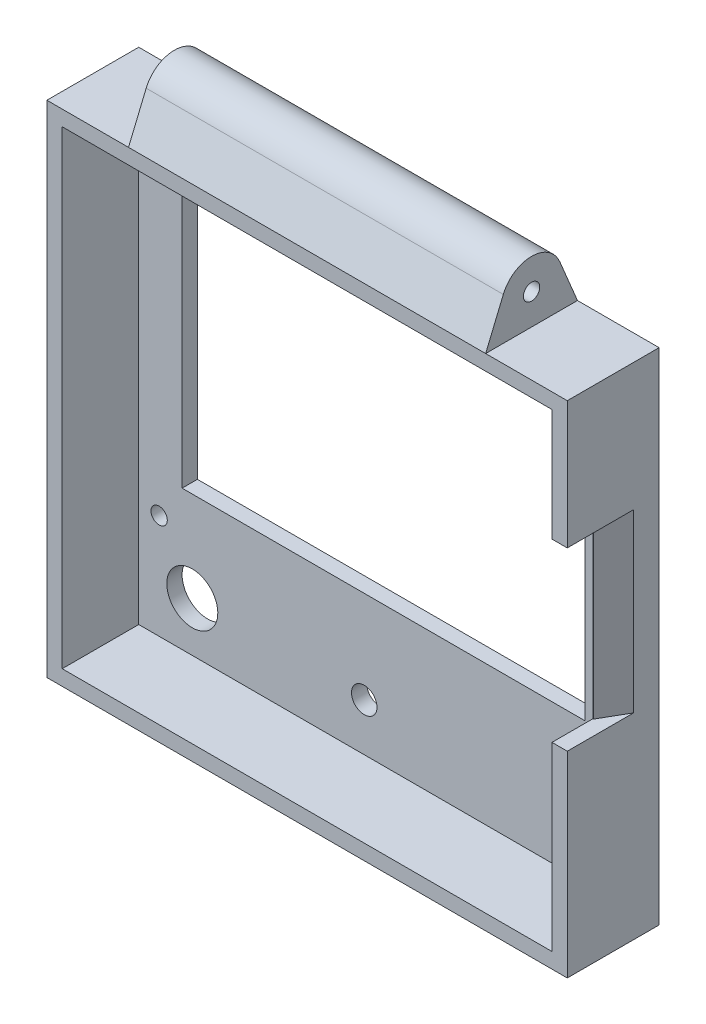
ISO-10303-21;
HEADER;
FILE_DESCRIPTION(('STEP AP214'),'2;1');
FILE_NAME('part.step','',(''),(''),'','','');
FILE_SCHEMA(('AUTOMOTIVE_DESIGN { 1 0 10303 214 1 1 1 1 }'));
ENDSEC;
DATA;
#1=APPLICATION_CONTEXT('core data for automotive mechanical design processes');
#2=APPLICATION_PROTOCOL_DEFINITION('international standard','automotive_design',2000,#1);
#3=PRODUCT_CONTEXT('',#1,'mechanical');
#4=PRODUCT('Part','Part','',(#3));
#5=PRODUCT_RELATED_PRODUCT_CATEGORY('part','',(#4));
#6=PRODUCT_DEFINITION_FORMATION('','',#4);
#7=PRODUCT_DEFINITION_CONTEXT('part definition',#1,'design');
#8=PRODUCT_DEFINITION('design','',#6,#7);
#9=PRODUCT_DEFINITION_SHAPE('','',#8);
#10=(LENGTH_UNIT() NAMED_UNIT(*) SI_UNIT(.MILLI.,.METRE.));
#11=(NAMED_UNIT(*) PLANE_ANGLE_UNIT() SI_UNIT($,.RADIAN.));
#12=(NAMED_UNIT(*) SI_UNIT($,.STERADIAN.) SOLID_ANGLE_UNIT());
#13=UNCERTAINTY_MEASURE_WITH_UNIT(LENGTH_MEASURE(1.E-05),#10,'distance_accuracy_value','');
#14=(GEOMETRIC_REPRESENTATION_CONTEXT(3) GLOBAL_UNCERTAINTY_ASSIGNED_CONTEXT((#13)) GLOBAL_UNIT_ASSIGNED_CONTEXT((#10,
#11,#12)) REPRESENTATION_CONTEXT('',''));
#15=CARTESIAN_POINT('',(0.,0.,0.));
#16=DIRECTION('',(0.,0.,1.));
#17=DIRECTION('',(1.,0.,0.));
#18=AXIS2_PLACEMENT_3D('',#15,#16,#17);
#19=CARTESIAN_POINT('',(51.,98.,0.));
#20=DIRECTION('',(0.,0.,-1.));
#21=DIRECTION('',(0.,1.,0.));
#22=AXIS2_PLACEMENT_3D('',#19,#20,#21);
#23=PLANE('',#22);
#24=DIRECTION('',(0.,-1.,0.));
#25=VECTOR('',#24,1.);
#26=CARTESIAN_POINT('',(48.,98.,0.));
#27=LINE('',#26,#25);
#28=CARTESIAN_POINT('',(48.,95.,0.));
#29=VERTEX_POINT('',#28);
#30=CARTESIAN_POINT('',(48.,73.,0.));
#31=VERTEX_POINT('',#30);
#32=EDGE_CURVE('E377',#29,#31,#27,.T.);
#33=ORIENTED_EDGE('',*,*,#32,.T.);
#34=DIRECTION('',(1.,0.,0.));
#35=VECTOR('',#34,1.);
#36=CARTESIAN_POINT('',(41.,73.,0.));
#37=LINE('',#36,#35);
#38=CARTESIAN_POINT('',(51.,73.,0.));
#39=VERTEX_POINT('',#38);
#40=EDGE_CURVE('E258',#31,#39,#37,.T.);
#41=ORIENTED_EDGE('',*,*,#40,.T.);
#42=DIRECTION('',(0.,-1.,0.));
#43=VECTOR('',#42,1.);
#44=CARTESIAN_POINT('',(51.,98.,0.));
#45=LINE('',#44,#43);
#46=CARTESIAN_POINT('',(51.,98.,0.));
#47=VERTEX_POINT('',#46);
#48=EDGE_CURVE('E194',#47,#39,#45,.T.);
#49=ORIENTED_EDGE('',*,*,#48,.F.);
#50=DIRECTION('',(-1.,0.,0.));
#51=VECTOR('',#50,1.);
#52=CARTESIAN_POINT('',(51.,98.,0.));
#53=LINE('',#52,#51);
#54=CARTESIAN_POINT('',(35.,98.,0.));
#55=VERTEX_POINT('',#54);
#56=EDGE_CURVE('E214',#47,#55,#53,.T.);
#57=ORIENTED_EDGE('',*,*,#56,.T.);
#58=CARTESIAN_POINT('',(-35.,98.,0.));
#59=VERTEX_POINT('',#58);
#60=EDGE_CURVE('E209',#55,#59,#53,.T.);
#61=ORIENTED_EDGE('',*,*,#60,.T.);
#62=DIRECTION('',(-1.,0.,0.));
#63=VECTOR('',#62,1.);
#64=CARTESIAN_POINT('',(-35.,98.,0.));
#65=LINE('',#64,#63);
#66=CARTESIAN_POINT('',(-51.,98.,0.));
#67=VERTEX_POINT('',#66);
#68=EDGE_CURVE('E262',#59,#67,#65,.T.);
#69=ORIENTED_EDGE('',*,*,#68,.T.);
#70=DIRECTION('',(0.,-1.,0.));
#71=VECTOR('',#70,1.);
#72=CARTESIAN_POINT('',(-51.,98.,0.));
#73=LINE('',#72,#71);
#74=CARTESIAN_POINT('',(-51.,0.,0.));
#75=VERTEX_POINT('',#74);
#76=EDGE_CURVE('E210',#67,#75,#73,.T.);
#77=ORIENTED_EDGE('',*,*,#76,.T.);
#78=DIRECTION('',(-1.,0.,0.));
#79=VECTOR('',#78,1.);
#80=CARTESIAN_POINT('',(51.,0.,0.));
#81=LINE('',#80,#79);
#82=CARTESIAN_POINT('',(51.,0.,0.));
#83=VERTEX_POINT('',#82);
#84=EDGE_CURVE('E193',#83,#75,#81,.T.);
#85=ORIENTED_EDGE('',*,*,#84,.F.);
#86=CARTESIAN_POINT('',(51.,38.5,0.));
#87=VERTEX_POINT('',#86);
#88=EDGE_CURVE('E183',#87,#83,#45,.T.);
#89=ORIENTED_EDGE('',*,*,#88,.F.);
#90=DIRECTION('',(1.,0.,0.));
#91=VECTOR('',#90,1.);
#92=CARTESIAN_POINT('',(41.,38.5,0.));
#93=LINE('',#92,#91);
#94=CARTESIAN_POINT('',(48.,38.5,0.));
#95=VERTEX_POINT('',#94);
#96=EDGE_CURVE('E173',#95,#87,#93,.T.);
#97=ORIENTED_EDGE('',*,*,#96,.F.);
#98=CARTESIAN_POINT('',(48.,3.,0.));
#99=VERTEX_POINT('',#98);
#100=EDGE_CURVE('E386',#95,#99,#27,.T.);
#101=ORIENTED_EDGE('',*,*,#100,.T.);
#102=DIRECTION('',(-1.,0.,0.));
#103=VECTOR('',#102,1.);
#104=CARTESIAN_POINT('',(51.,3.,0.));
#105=LINE('',#104,#103);
#106=CARTESIAN_POINT('',(-48.,3.,0.));
#107=VERTEX_POINT('',#106);
#108=EDGE_CURVE('E212',#99,#107,#105,.T.);
#109=ORIENTED_EDGE('',*,*,#108,.T.);
#110=DIRECTION('',(0.,-1.,0.));
#111=VECTOR('',#110,1.);
#112=CARTESIAN_POINT('',(-48.,98.,0.));
#113=LINE('',#112,#111);
#114=CARTESIAN_POINT('',(-48.,95.,0.));
#115=VERTEX_POINT('',#114);
#116=EDGE_CURVE('E203',#115,#107,#113,.T.);
#117=ORIENTED_EDGE('',*,*,#116,.F.);
#118=DIRECTION('',(-1.,0.,0.));
#119=VECTOR('',#118,1.);
#120=CARTESIAN_POINT('',(51.,95.,0.));
#121=LINE('',#120,#119);
#122=EDGE_CURVE('E382',#29,#115,#121,.T.);
#123=ORIENTED_EDGE('',*,*,#122,.F.);
#124=EDGE_LOOP('',(#33,#41,#49,#57,#61,#69,#77,#85,#89,#97,#101,#109,#117,#123));
#125=FACE_BOUND('',#124,.T.);
#126=ADVANCED_FACE('F33',(#125),#23,.F.);
#127=CARTESIAN_POINT('',(51.,0.,0.));
#128=DIRECTION('',(0.,1.,0.));
#129=DIRECTION('',(0.,0.,1.));
#130=AXIS2_PLACEMENT_3D('',#127,#128,#129);
#131=PLANE('',#130);
#132=DIRECTION('',(0.,0.,-1.));
#133=VECTOR('',#132,1.);
#134=CARTESIAN_POINT('',(-51.,0.,0.));
#135=LINE('',#134,#133);
#136=CARTESIAN_POINT('',(-51.,0.,-18.));
#137=VERTEX_POINT('',#136);
#138=EDGE_CURVE('E199',#75,#137,#135,.T.);
#139=ORIENTED_EDGE('',*,*,#138,.T.);
#140=DIRECTION('',(-1.,0.,0.));
#141=VECTOR('',#140,1.);
#142=CARTESIAN_POINT('',(51.,0.,-18.));
#143=LINE('',#142,#141);
#144=CARTESIAN_POINT('',(51.,0.,-18.));
#145=VERTEX_POINT('',#144);
#146=EDGE_CURVE('E221',#145,#137,#143,.T.);
#147=ORIENTED_EDGE('',*,*,#146,.F.);
#148=DIRECTION('',(0.,0.,-1.));
#149=VECTOR('',#148,1.);
#150=CARTESIAN_POINT('',(51.,0.,0.));
#151=LINE('',#150,#149);
#152=EDGE_CURVE('E197',#83,#145,#151,.T.);
#153=ORIENTED_EDGE('',*,*,#152,.F.);
#154=ORIENTED_EDGE('',*,*,#84,.T.);
#155=EDGE_LOOP('',(#139,#147,#153,#154));
#156=FACE_BOUND('',#155,.T.);
#157=ADVANCED_FACE('F443',(#156),#131,.F.);
#158=CARTESIAN_POINT('',(51.,0.,-18.));
#159=DIRECTION('',(0.,0.,1.));
#160=DIRECTION('',(0.,-1.,0.));
#161=AXIS2_PLACEMENT_3D('',#158,#159,#160);
#162=PLANE('',#161);
#163=CARTESIAN_POINT('',(-3.79999999999999,12.3,-18.));
#164=DIRECTION('',(0.,0.,-1.));
#165=DIRECTION('',(-1.,0.,0.));
#166=AXIS2_PLACEMENT_3D('',#163,#164,#165);
#167=CIRCLE('',#166,2.5);
#168=CARTESIAN_POINT('',(-6.29999999999999,12.3,-18.));
#169=VERTEX_POINT('',#168);
#170=EDGE_CURVE('E292',#169,#169,#167,.T.);
#171=ORIENTED_EDGE('',*,*,#170,.F.);
#172=EDGE_LOOP('',(#171));
#173=FACE_BOUND('',#172,.T.);
#174=CARTESIAN_POINT('',(36.75,15.3,-18.));
#175=DIRECTION('',(0.,0.,-1.));
#176=DIRECTION('',(-1.,0.,0.));
#177=AXIS2_PLACEMENT_3D('',#174,#175,#176);
#178=CIRCLE('',#177,3.);
#179=CARTESIAN_POINT('',(33.75,15.3,-18.));
#180=VERTEX_POINT('',#179);
#181=EDGE_CURVE('E308',#180,#180,#178,.T.);
#182=ORIENTED_EDGE('',*,*,#181,.F.);
#183=EDGE_LOOP('',(#182));
#184=FACE_BOUND('',#183,.T.);
#185=CARTESIAN_POINT('',(-37.5,12.7,-18.));
#186=DIRECTION('',(0.,0.,-1.));
#187=DIRECTION('',(-1.,0.,0.));
#188=AXIS2_PLACEMENT_3D('',#185,#186,#187);
#189=CIRCLE('',#188,5.);
#190=CARTESIAN_POINT('',(-42.5,12.7,-18.));
#191=VERTEX_POINT('',#190);
#192=EDGE_CURVE('E302',#191,#191,#189,.T.);
#193=ORIENTED_EDGE('',*,*,#192,.F.);
#194=EDGE_LOOP('',(#193));
#195=FACE_BOUND('',#194,.T.);
#196=CARTESIAN_POINT('',(-44.,23.5,-18.));
#197=DIRECTION('',(0.,0.,-1.));
#198=DIRECTION('',(-1.,0.,0.));
#199=AXIS2_PLACEMENT_3D('',#196,#197,#198);
#200=CIRCLE('',#199,1.6);
#201=CARTESIAN_POINT('',(-45.6,23.5,-18.));
#202=VERTEX_POINT('',#201);
#203=EDGE_CURVE('E294',#202,#202,#200,.T.);
#204=ORIENTED_EDGE('',*,*,#203,.F.);
#205=EDGE_LOOP('',(#204));
#206=FACE_BOUND('',#205,.T.);
#207=CARTESIAN_POINT('',(44.,23.5,-18.));
#208=DIRECTION('',(0.,0.,-1.));
#209=DIRECTION('',(-1.,0.,0.));
#210=AXIS2_PLACEMENT_3D('',#207,#208,#209);
#211=CIRCLE('',#210,1.6);
#212=CARTESIAN_POINT('',(42.4,23.5,-18.));
#213=VERTEX_POINT('',#212);
#214=EDGE_CURVE('E301',#213,#213,#211,.T.);
#215=ORIENTED_EDGE('',*,*,#214,.F.);
#216=EDGE_LOOP('',(#215));
#217=FACE_BOUND('',#216,.T.);
#218=CARTESIAN_POINT('',(44.,88.5,-18.));
#219=DIRECTION('',(0.,0.,-1.));
#220=DIRECTION('',(-1.,0.,0.));
#221=AXIS2_PLACEMENT_3D('',#218,#219,#220);
#222=CIRCLE('',#221,1.6);
#223=CARTESIAN_POINT('',(42.4,88.5,-18.));
#224=VERTEX_POINT('',#223);
#225=EDGE_CURVE('E326',#224,#224,#222,.T.);
#226=ORIENTED_EDGE('',*,*,#225,.F.);
#227=EDGE_LOOP('',(#226));
#228=FACE_BOUND('',#227,.T.);
#229=CARTESIAN_POINT('',(-44.,88.5,-18.));
#230=DIRECTION('',(0.,0.,-1.));
#231=DIRECTION('',(-1.,0.,0.));
#232=AXIS2_PLACEMENT_3D('',#229,#230,#231);
#233=CIRCLE('',#232,1.6);
#234=CARTESIAN_POINT('',(-45.6,88.5,-18.));
#235=VERTEX_POINT('',#234);
#236=EDGE_CURVE('E318',#235,#235,#233,.T.);
#237=ORIENTED_EDGE('',*,*,#236,.F.);
#238=EDGE_LOOP('',(#237));
#239=FACE_BOUND('',#238,.T.);
#240=DIRECTION('',(0.,-1.,0.));
#241=VECTOR('',#240,1.);
#242=CARTESIAN_POINT('',(39.5,82.,-18.));
#243=LINE('',#242,#241);
#244=CARTESIAN_POINT('',(39.5,82.,-18.));
#245=VERTEX_POINT('',#244);
#246=CARTESIAN_POINT('',(39.5,30.4,-18.));
#247=VERTEX_POINT('',#246);
#248=EDGE_CURVE('E339',#245,#247,#243,.T.);
#249=ORIENTED_EDGE('',*,*,#248,.F.);
#250=DIRECTION('',(1.,0.,0.));
#251=VECTOR('',#250,1.);
#252=CARTESIAN_POINT('',(39.5,82.,-18.));
#253=LINE('',#252,#251);
#254=CARTESIAN_POINT('',(-39.5,82.,-18.));
#255=VERTEX_POINT('',#254);
#256=EDGE_CURVE('E342',#255,#245,#253,.T.);
#257=ORIENTED_EDGE('',*,*,#256,.F.);
#258=DIRECTION('',(0.,1.,0.));
#259=VECTOR('',#258,1.);
#260=CARTESIAN_POINT('',(-39.5,82.,-18.));
#261=LINE('',#260,#259);
#262=CARTESIAN_POINT('',(-39.5,30.4,-18.));
#263=VERTEX_POINT('',#262);
#264=EDGE_CURVE('E325',#263,#255,#261,.T.);
#265=ORIENTED_EDGE('',*,*,#264,.F.);
#266=DIRECTION('',(-1.,0.,0.));
#267=VECTOR('',#266,1.);
#268=CARTESIAN_POINT('',(39.5,30.4,-18.));
#269=LINE('',#268,#267);
#270=EDGE_CURVE('E336',#247,#263,#269,.T.);
#271=ORIENTED_EDGE('',*,*,#270,.F.);
#272=EDGE_LOOP('',(#249,#257,#265,#271));
#273=FACE_BOUND('',#272,.T.);
#274=DIRECTION('',(0.,1.,0.));
#275=VECTOR('',#274,1.);
#276=CARTESIAN_POINT('',(-51.,0.,-18.));
#277=LINE('',#276,#275);
#278=CARTESIAN_POINT('',(-51.,98.,-18.));
#279=VERTEX_POINT('',#278);
#280=EDGE_CURVE('E195',#137,#279,#277,.T.);
#281=ORIENTED_EDGE('',*,*,#280,.T.);
#282=DIRECTION('',(-1.,0.,0.));
#283=VECTOR('',#282,1.);
#284=CARTESIAN_POINT('',(-35.,98.,-18.));
#285=LINE('',#284,#283);
#286=CARTESIAN_POINT('',(-35.,98.,-18.));
#287=VERTEX_POINT('',#286);
#288=EDGE_CURVE('E266',#287,#279,#285,.T.);
#289=ORIENTED_EDGE('',*,*,#288,.F.);
#290=DIRECTION('',(-1.,0.,0.));
#291=VECTOR('',#290,1.);
#292=CARTESIAN_POINT('',(51.,98.,-18.));
#293=LINE('',#292,#291);
#294=CARTESIAN_POINT('',(35.,98.,-18.));
#295=VERTEX_POINT('',#294);
#296=EDGE_CURVE('E217',#295,#287,#293,.T.);
#297=ORIENTED_EDGE('',*,*,#296,.F.);
#298=CARTESIAN_POINT('',(51.,98.,-18.));
#299=VERTEX_POINT('',#298);
#300=EDGE_CURVE('E218',#299,#295,#293,.T.);
#301=ORIENTED_EDGE('',*,*,#300,.F.);
#302=DIRECTION('',(0.,1.,0.));
#303=VECTOR('',#302,1.);
#304=CARTESIAN_POINT('',(51.,0.,-18.));
#305=LINE('',#304,#303);
#306=EDGE_CURVE('E206',#145,#299,#305,.T.);
#307=ORIENTED_EDGE('',*,*,#306,.F.);
#308=ORIENTED_EDGE('',*,*,#146,.T.);
#309=EDGE_LOOP('',(#281,#289,#297,#301,#307,#308));
#310=FACE_BOUND('',#309,.T.);
#311=ADVANCED_FACE('F438',(#173,#184,#195,#206,#217,#228,#239,#273,#310),#162,.F.);
#312=CARTESIAN_POINT('',(51.,0.,0.));
#313=DIRECTION('',(1.,0.,0.));
#314=DIRECTION('',(0.,0.,-1.));
#315=AXIS2_PLACEMENT_3D('',#312,#313,#314);
#316=PLANE('',#315);
#317=DIRECTION('',(0.,0.,1.));
#318=VECTOR('',#317,1.);
#319=CARTESIAN_POINT('',(51.,73.,0.));
#320=LINE('',#319,#318);
#321=CARTESIAN_POINT('',(51.,73.,-13.));
#322=VERTEX_POINT('',#321);
#323=EDGE_CURVE('E48',#322,#39,#320,.T.);
#324=ORIENTED_EDGE('',*,*,#323,.F.);
#325=DIRECTION('',(0.,-1.,0.));
#326=VECTOR('',#325,1.);
#327=CARTESIAN_POINT('',(51.,38.5,-13.));
#328=LINE('',#327,#326);
#329=CARTESIAN_POINT('',(51.,38.5,-13.));
#330=VERTEX_POINT('',#329);
#331=EDGE_CURVE('E186',#322,#330,#328,.T.);
#332=ORIENTED_EDGE('',*,*,#331,.T.);
#333=DIRECTION('',(0.,0.,-1.));
#334=VECTOR('',#333,1.);
#335=CARTESIAN_POINT('',(51.,38.5,0.));
#336=LINE('',#335,#334);
#337=EDGE_CURVE('E55',#87,#330,#336,.T.);
#338=ORIENTED_EDGE('',*,*,#337,.F.);
#339=ORIENTED_EDGE('',*,*,#88,.T.);
#340=ORIENTED_EDGE('',*,*,#152,.T.);
#341=ORIENTED_EDGE('',*,*,#306,.T.);
#342=DIRECTION('',(0.,0.,-1.));
#343=VECTOR('',#342,1.);
#344=CARTESIAN_POINT('',(51.,98.,0.));
#345=LINE('',#344,#343);
#346=EDGE_CURVE('E229',#47,#299,#345,.T.);
#347=ORIENTED_EDGE('',*,*,#346,.F.);
#348=ORIENTED_EDGE('',*,*,#48,.T.);
#349=EDGE_LOOP('',(#324,#332,#338,#339,#340,#341,#347,#348));
#350=FACE_BOUND('',#349,.T.);
#351=ADVANCED_FACE('F182',(#350),#316,.T.);
#352=CARTESIAN_POINT('',(-51.,0.,0.));
#353=DIRECTION('',(1.,0.,0.));
#354=DIRECTION('',(0.,0.,-1.));
#355=AXIS2_PLACEMENT_3D('',#352,#353,#354);
#356=PLANE('',#355);
#357=ORIENTED_EDGE('',*,*,#76,.F.);
#358=DIRECTION('',(0.,0.,-1.));
#359=VECTOR('',#358,1.);
#360=CARTESIAN_POINT('',(-51.,98.,0.));
#361=LINE('',#360,#359);
#362=EDGE_CURVE('E234',#67,#279,#361,.T.);
#363=ORIENTED_EDGE('',*,*,#362,.T.);
#364=ORIENTED_EDGE('',*,*,#280,.F.);
#365=ORIENTED_EDGE('',*,*,#138,.F.);
#366=EDGE_LOOP('',(#357,#363,#364,#365));
#367=FACE_BOUND('',#366,.T.);
#368=ADVANCED_FACE('F436',(#367),#356,.F.);
#369=CARTESIAN_POINT('',(51.,3.,0.));
#370=DIRECTION('',(0.,1.,0.));
#371=DIRECTION('',(0.,0.,1.));
#372=AXIS2_PLACEMENT_3D('',#369,#370,#371);
#373=PLANE('',#372);
#374=DIRECTION('',(0.,0.,-1.));
#375=VECTOR('',#374,1.);
#376=CARTESIAN_POINT('',(-48.,3.,0.));
#377=LINE('',#376,#375);
#378=CARTESIAN_POINT('',(-48.,3.00000000000001,-15.));
#379=VERTEX_POINT('',#378);
#380=EDGE_CURVE('E367',#107,#379,#377,.T.);
#381=ORIENTED_EDGE('',*,*,#380,.F.);
#382=ORIENTED_EDGE('',*,*,#108,.F.);
#383=DIRECTION('',(0.,0.,-1.));
#384=VECTOR('',#383,1.);
#385=CARTESIAN_POINT('',(48.,3.,0.));
#386=LINE('',#385,#384);
#387=CARTESIAN_POINT('',(48.,3.00000000000001,-15.));
#388=VERTEX_POINT('',#387);
#389=EDGE_CURVE('E374',#99,#388,#386,.T.);
#390=ORIENTED_EDGE('',*,*,#389,.T.);
#391=DIRECTION('',(-1.,0.,0.));
#392=VECTOR('',#391,1.);
#393=CARTESIAN_POINT('',(51.,3.00000000000001,-15.));
#394=LINE('',#393,#392);
#395=EDGE_CURVE('E370',#388,#379,#394,.T.);
#396=ORIENTED_EDGE('',*,*,#395,.T.);
#397=EDGE_LOOP('',(#381,#382,#390,#396));
#398=FACE_BOUND('',#397,.T.);
#399=ADVANCED_FACE('F456',(#398),#373,.T.);
#400=CARTESIAN_POINT('',(51.,0.,-15.));
#401=DIRECTION('',(0.,0.,1.));
#402=DIRECTION('',(0.,-1.,0.));
#403=AXIS2_PLACEMENT_3D('',#400,#401,#402);
#404=PLANE('',#403);
#405=CARTESIAN_POINT('',(-3.79999999999999,12.3,-15.));
#406=DIRECTION('',(0.,0.,1.));
#407=DIRECTION('',(0.,-1.,0.));
#408=AXIS2_PLACEMENT_3D('',#405,#406,#407);
#409=CIRCLE('',#408,2.5);
#410=CARTESIAN_POINT('',(-3.79999999999999,9.80000000000001,-15.));
#411=VERTEX_POINT('',#410);
#412=EDGE_CURVE('E311',#411,#411,#409,.F.);
#413=ORIENTED_EDGE('',*,*,#412,.T.);
#414=EDGE_LOOP('',(#413));
#415=FACE_BOUND('',#414,.T.);
#416=CARTESIAN_POINT('',(36.75,15.3,-15.));
#417=DIRECTION('',(0.,0.,1.));
#418=DIRECTION('',(0.,-1.,0.));
#419=AXIS2_PLACEMENT_3D('',#416,#417,#418);
#420=CIRCLE('',#419,3.);
#421=CARTESIAN_POINT('',(36.75,12.3,-15.));
#422=VERTEX_POINT('',#421);
#423=EDGE_CURVE('E305',#422,#422,#420,.F.);
#424=ORIENTED_EDGE('',*,*,#423,.T.);
#425=EDGE_LOOP('',(#424));
#426=FACE_BOUND('',#425,.T.);
#427=CARTESIAN_POINT('',(-37.5,12.7,-15.));
#428=DIRECTION('',(0.,0.,1.));
#429=DIRECTION('',(0.,-1.,0.));
#430=AXIS2_PLACEMENT_3D('',#427,#428,#429);
#431=CIRCLE('',#430,5.);
#432=CARTESIAN_POINT('',(-37.5,7.70000000000003,-15.));
#433=VERTEX_POINT('',#432);
#434=EDGE_CURVE('E298',#433,#433,#431,.F.);
#435=ORIENTED_EDGE('',*,*,#434,.T.);
#436=EDGE_LOOP('',(#435));
#437=FACE_BOUND('',#436,.T.);
#438=CARTESIAN_POINT('',(-44.,23.5,-15.));
#439=DIRECTION('',(0.,0.,1.));
#440=DIRECTION('',(0.,-1.,0.));
#441=AXIS2_PLACEMENT_3D('',#438,#439,#440);
#442=CIRCLE('',#441,1.6);
#443=CARTESIAN_POINT('',(-44.,21.9,-15.));
#444=VERTEX_POINT('',#443);
#445=EDGE_CURVE('E297',#444,#444,#442,.F.);
#446=ORIENTED_EDGE('',*,*,#445,.T.);
#447=EDGE_LOOP('',(#446));
#448=FACE_BOUND('',#447,.T.);
#449=CARTESIAN_POINT('',(44.,23.5,-15.));
#450=DIRECTION('',(0.,0.,1.));
#451=DIRECTION('',(0.,-1.,0.));
#452=AXIS2_PLACEMENT_3D('',#449,#450,#451);
#453=CIRCLE('',#452,1.6);
#454=CARTESIAN_POINT('',(44.,21.9,-15.));
#455=VERTEX_POINT('',#454);
#456=EDGE_CURVE('E329',#455,#455,#453,.F.);
#457=ORIENTED_EDGE('',*,*,#456,.T.);
#458=EDGE_LOOP('',(#457));
#459=FACE_BOUND('',#458,.T.);
#460=CARTESIAN_POINT('',(44.,88.5,-15.));
#461=DIRECTION('',(0.,0.,1.));
#462=DIRECTION('',(0.,-1.,0.));
#463=AXIS2_PLACEMENT_3D('',#460,#461,#462);
#464=CIRCLE('',#463,1.6);
#465=CARTESIAN_POINT('',(44.,86.9,-15.));
#466=VERTEX_POINT('',#465);
#467=EDGE_CURVE('E322',#466,#466,#464,.F.);
#468=ORIENTED_EDGE('',*,*,#467,.T.);
#469=EDGE_LOOP('',(#468));
#470=FACE_BOUND('',#469,.T.);
#471=CARTESIAN_POINT('',(-44.,88.5,-15.));
#472=DIRECTION('',(0.,0.,1.));
#473=DIRECTION('',(0.,-1.,0.));
#474=AXIS2_PLACEMENT_3D('',#471,#472,#473);
#475=CIRCLE('',#474,1.6);
#476=CARTESIAN_POINT('',(-44.,86.9,-15.));
#477=VERTEX_POINT('',#476);
#478=EDGE_CURVE('E321',#477,#477,#475,.F.);
#479=ORIENTED_EDGE('',*,*,#478,.T.);
#480=EDGE_LOOP('',(#479));
#481=FACE_BOUND('',#480,.T.);
#482=DIRECTION('',(1.,0.,0.));
#483=VECTOR('',#482,1.);
#484=CARTESIAN_POINT('',(39.5,82.,-15.));
#485=LINE('',#484,#483);
#486=CARTESIAN_POINT('',(-39.5,82.,-15.));
#487=VERTEX_POINT('',#486);
#488=CARTESIAN_POINT('',(39.5,82.,-15.));
#489=VERTEX_POINT('',#488);
#490=EDGE_CURVE('E338',#487,#489,#485,.T.);
#491=ORIENTED_EDGE('',*,*,#490,.T.);
#492=DIRECTION('',(0.,-1.,0.));
#493=VECTOR('',#492,1.);
#494=CARTESIAN_POINT('',(39.5,82.,-15.));
#495=LINE('',#494,#493);
#496=CARTESIAN_POINT('',(39.5,30.4,-15.));
#497=VERTEX_POINT('',#496);
#498=EDGE_CURVE('E359',#489,#497,#495,.T.);
#499=ORIENTED_EDGE('',*,*,#498,.T.);
#500=DIRECTION('',(-1.,0.,0.));
#501=VECTOR('',#500,1.);
#502=CARTESIAN_POINT('',(39.5,30.4,-15.));
#503=LINE('',#502,#501);
#504=CARTESIAN_POINT('',(-39.5,30.4,-15.));
#505=VERTEX_POINT('',#504);
#506=EDGE_CURVE('E355',#497,#505,#503,.T.);
#507=ORIENTED_EDGE('',*,*,#506,.T.);
#508=DIRECTION('',(0.,1.,0.));
#509=VECTOR('',#508,1.);
#510=CARTESIAN_POINT('',(-39.5,82.,-15.));
#511=LINE('',#510,#509);
#512=EDGE_CURVE('E350',#505,#487,#511,.T.);
#513=ORIENTED_EDGE('',*,*,#512,.T.);
#514=EDGE_LOOP('',(#491,#499,#507,#513));
#515=FACE_BOUND('',#514,.T.);
#516=DIRECTION('',(0.,1.,0.));
#517=VECTOR('',#516,1.);
#518=CARTESIAN_POINT('',(-48.,0.,-15.));
#519=LINE('',#518,#517);
#520=CARTESIAN_POINT('',(-48.,95.,-15.));
#521=VERTEX_POINT('',#520);
#522=EDGE_CURVE('E369',#379,#521,#519,.T.);
#523=ORIENTED_EDGE('',*,*,#522,.F.);
#524=ORIENTED_EDGE('',*,*,#395,.F.);
#525=DIRECTION('',(0.,1.,0.));
#526=VECTOR('',#525,1.);
#527=CARTESIAN_POINT('',(48.,0.,-15.));
#528=LINE('',#527,#526);
#529=CARTESIAN_POINT('',(48.,95.,-15.));
#530=VERTEX_POINT('',#529);
#531=EDGE_CURVE('E376',#388,#530,#528,.T.);
#532=ORIENTED_EDGE('',*,*,#531,.T.);
#533=DIRECTION('',(-1.,0.,0.));
#534=VECTOR('',#533,1.);
#535=CARTESIAN_POINT('',(51.,95.,-15.));
#536=LINE('',#535,#534);
#537=EDGE_CURVE('E373',#530,#521,#536,.T.);
#538=ORIENTED_EDGE('',*,*,#537,.T.);
#539=EDGE_LOOP('',(#523,#524,#532,#538));
#540=FACE_BOUND('',#539,.T.);
#541=ADVANCED_FACE('F406',(#415,#426,#437,#448,#459,#470,#481,#515,#540),#404,.T.);
#542=CARTESIAN_POINT('',(51.,95.,-18.));
#543=DIRECTION('',(0.,-1.,0.));
#544=DIRECTION('',(0.,0.,-1.));
#545=AXIS2_PLACEMENT_3D('',#542,#543,#544);
#546=PLANE('',#545);
#547=DIRECTION('',(0.,0.,1.));
#548=VECTOR('',#547,1.);
#549=CARTESIAN_POINT('',(-48.,95.,-18.));
#550=LINE('',#549,#548);
#551=EDGE_CURVE('E379',#521,#115,#550,.T.);
#552=ORIENTED_EDGE('',*,*,#551,.F.);
#553=ORIENTED_EDGE('',*,*,#537,.F.);
#554=DIRECTION('',(0.,0.,1.));
#555=VECTOR('',#554,1.);
#556=CARTESIAN_POINT('',(48.,95.,-18.));
#557=LINE('',#556,#555);
#558=EDGE_CURVE('E384',#530,#29,#557,.T.);
#559=ORIENTED_EDGE('',*,*,#558,.T.);
#560=ORIENTED_EDGE('',*,*,#122,.T.);
#561=EDGE_LOOP('',(#552,#553,#559,#560));
#562=FACE_BOUND('',#561,.T.);
#563=ADVANCED_FACE('F396',(#562),#546,.T.);
#564=CARTESIAN_POINT('',(48.,0.,0.));
#565=DIRECTION('',(1.,0.,0.));
#566=DIRECTION('',(0.,0.,-1.));
#567=AXIS2_PLACEMENT_3D('',#564,#565,#566);
#568=PLANE('',#567);
#569=DIRECTION('',(0.,1.,0.));
#570=VECTOR('',#569,1.);
#571=CARTESIAN_POINT('',(48.,0.,-8.00000000000001));
#572=LINE('',#571,#570);
#573=CARTESIAN_POINT('',(48.,38.5,-8.));
#574=VERTEX_POINT('',#573);
#575=CARTESIAN_POINT('',(48.,73.,-8.));
#576=VERTEX_POINT('',#575);
#577=EDGE_CURVE('E236',#574,#576,#572,.T.);
#578=ORIENTED_EDGE('',*,*,#577,.T.);
#579=DIRECTION('',(0.,0.,1.));
#580=VECTOR('',#579,1.);
#581=CARTESIAN_POINT('',(48.,73.,0.));
#582=LINE('',#581,#580);
#583=EDGE_CURVE('E239',#576,#31,#582,.T.);
#584=ORIENTED_EDGE('',*,*,#583,.T.);
#585=ORIENTED_EDGE('',*,*,#32,.F.);
#586=ORIENTED_EDGE('',*,*,#558,.F.);
#587=ORIENTED_EDGE('',*,*,#531,.F.);
#588=ORIENTED_EDGE('',*,*,#389,.F.);
#589=ORIENTED_EDGE('',*,*,#100,.F.);
#590=DIRECTION('',(0.,0.,-1.));
#591=VECTOR('',#590,1.);
#592=CARTESIAN_POINT('',(48.,38.5,0.));
#593=LINE('',#592,#591);
#594=EDGE_CURVE('E176',#95,#574,#593,.T.);
#595=ORIENTED_EDGE('',*,*,#594,.T.);
#596=EDGE_LOOP('',(#578,#584,#585,#586,#587,#588,#589,#595));
#597=FACE_BOUND('',#596,.T.);
#598=ADVANCED_FACE('F409',(#597),#568,.F.);
#599=CARTESIAN_POINT('',(-48.,0.,0.));
#600=DIRECTION('',(1.,0.,0.));
#601=DIRECTION('',(0.,0.,-1.));
#602=AXIS2_PLACEMENT_3D('',#599,#600,#601);
#603=PLANE('',#602);
#604=ORIENTED_EDGE('',*,*,#116,.T.);
#605=ORIENTED_EDGE('',*,*,#380,.T.);
#606=ORIENTED_EDGE('',*,*,#522,.T.);
#607=ORIENTED_EDGE('',*,*,#551,.T.);
#608=EDGE_LOOP('',(#604,#605,#606,#607));
#609=FACE_BOUND('',#608,.T.);
#610=ADVANCED_FACE('F402',(#609),#603,.T.);
#611=CARTESIAN_POINT('',(39.5,82.,79.3586773964112));
#612=DIRECTION('',(0.,1.,0.));
#613=DIRECTION('',(-1.,0.,0.));
#614=AXIS2_PLACEMENT_3D('',#611,#612,#613);
#615=PLANE('',#614);
#616=DIRECTION('',(0.,0.,-1.));
#617=VECTOR('',#616,1.);
#618=CARTESIAN_POINT('',(-39.5,82.,79.3586773964112));
#619=LINE('',#618,#617);
#620=EDGE_CURVE('E353',#487,#255,#619,.T.);
#621=ORIENTED_EDGE('',*,*,#620,.T.);
#622=ORIENTED_EDGE('',*,*,#256,.T.);
#623=DIRECTION('',(0.,0.,-1.));
#624=VECTOR('',#623,1.);
#625=CARTESIAN_POINT('',(39.5,82.,79.3586773964112));
#626=LINE('',#625,#624);
#627=EDGE_CURVE('E349',#489,#245,#626,.T.);
#628=ORIENTED_EDGE('',*,*,#627,.F.);
#629=ORIENTED_EDGE('',*,*,#490,.F.);
#630=EDGE_LOOP('',(#621,#622,#628,#629));
#631=FACE_BOUND('',#630,.T.);
#632=ADVANCED_FACE('F461',(#631),#615,.F.);
#633=CARTESIAN_POINT('',(39.5,82.,79.3586773964112));
#634=DIRECTION('',(1.,0.,0.));
#635=DIRECTION('',(0.,0.,-1.));
#636=AXIS2_PLACEMENT_3D('',#633,#634,#635);
#637=PLANE('',#636);
#638=ORIENTED_EDGE('',*,*,#627,.T.);
#639=ORIENTED_EDGE('',*,*,#248,.T.);
#640=DIRECTION('',(0.,0.,-1.));
#641=VECTOR('',#640,1.);
#642=CARTESIAN_POINT('',(39.5,30.4,79.3586773964112));
#643=LINE('',#642,#641);
#644=EDGE_CURVE('E358',#497,#247,#643,.T.);
#645=ORIENTED_EDGE('',*,*,#644,.F.);
#646=ORIENTED_EDGE('',*,*,#498,.F.);
#647=EDGE_LOOP('',(#638,#639,#645,#646));
#648=FACE_BOUND('',#647,.T.);
#649=ADVANCED_FACE('F474',(#648),#637,.F.);
#650=CARTESIAN_POINT('',(39.5,30.4,79.3586773964112));
#651=DIRECTION('',(0.,-1.,0.));
#652=DIRECTION('',(1.,0.,0.));
#653=AXIS2_PLACEMENT_3D('',#650,#651,#652);
#654=PLANE('',#653);
#655=ORIENTED_EDGE('',*,*,#644,.T.);
#656=ORIENTED_EDGE('',*,*,#270,.T.);
#657=DIRECTION('',(0.,0.,-1.));
#658=VECTOR('',#657,1.);
#659=CARTESIAN_POINT('',(-39.5,30.4,79.3586773964112));
#660=LINE('',#659,#658);
#661=EDGE_CURVE('E354',#505,#263,#660,.T.);
#662=ORIENTED_EDGE('',*,*,#661,.F.);
#663=ORIENTED_EDGE('',*,*,#506,.F.);
#664=EDGE_LOOP('',(#655,#656,#662,#663));
#665=FACE_BOUND('',#664,.T.);
#666=ADVANCED_FACE('F478',(#665),#654,.F.);
#667=CARTESIAN_POINT('',(-39.5,82.,79.3586773964112));
#668=DIRECTION('',(-1.,0.,0.));
#669=DIRECTION('',(0.,-1.,0.));
#670=AXIS2_PLACEMENT_3D('',#667,#668,#669);
#671=PLANE('',#670);
#672=ORIENTED_EDGE('',*,*,#661,.T.);
#673=ORIENTED_EDGE('',*,*,#264,.T.);
#674=ORIENTED_EDGE('',*,*,#620,.F.);
#675=ORIENTED_EDGE('',*,*,#512,.F.);
#676=EDGE_LOOP('',(#672,#673,#674,#675));
#677=FACE_BOUND('',#676,.T.);
#678=ADVANCED_FACE('F482',(#677),#671,.F.);
#679=CARTESIAN_POINT('',(-44.,88.5,79.3586773964112));
#680=DIRECTION('',(0.,0.,-1.));
#681=DIRECTION('',(-1.,0.,0.));
#682=AXIS2_PLACEMENT_3D('',#679,#680,#681);
#683=CYLINDRICAL_SURFACE('',#682,1.6);
#684=ORIENTED_EDGE('',*,*,#236,.T.);
#685=EDGE_LOOP('',(#684));
#686=FACE_BOUND('',#685,.T.);
#687=ORIENTED_EDGE('',*,*,#478,.F.);
#688=EDGE_LOOP('',(#687));
#689=FACE_BOUND('',#688,.T.);
#690=ADVANCED_FACE('F486',(#686,#689),#683,.F.);
#691=CARTESIAN_POINT('',(44.,88.5,79.3586773964112));
#692=DIRECTION('',(0.,0.,-1.));
#693=DIRECTION('',(-1.,0.,0.));
#694=AXIS2_PLACEMENT_3D('',#691,#692,#693);
#695=CYLINDRICAL_SURFACE('',#694,1.6);
#696=ORIENTED_EDGE('',*,*,#225,.T.);
#697=EDGE_LOOP('',(#696));
#698=FACE_BOUND('',#697,.T.);
#699=ORIENTED_EDGE('',*,*,#467,.F.);
#700=EDGE_LOOP('',(#699));
#701=FACE_BOUND('',#700,.T.);
#702=ADVANCED_FACE('F492',(#698,#701),#695,.F.);
#703=CARTESIAN_POINT('',(44.,23.5,79.3586773964112));
#704=DIRECTION('',(0.,0.,-1.));
#705=DIRECTION('',(-1.,0.,0.));
#706=AXIS2_PLACEMENT_3D('',#703,#704,#705);
#707=CYLINDRICAL_SURFACE('',#706,1.6);
#708=ORIENTED_EDGE('',*,*,#214,.T.);
#709=EDGE_LOOP('',(#708));
#710=FACE_BOUND('',#709,.T.);
#711=ORIENTED_EDGE('',*,*,#456,.F.);
#712=EDGE_LOOP('',(#711));
#713=FACE_BOUND('',#712,.T.);
#714=ADVANCED_FACE('F488',(#710,#713),#707,.F.);
#715=CARTESIAN_POINT('',(-44.,23.5,79.3586773964112));
#716=DIRECTION('',(0.,0.,-1.));
#717=DIRECTION('',(-1.,0.,0.));
#718=AXIS2_PLACEMENT_3D('',#715,#716,#717);
#719=CYLINDRICAL_SURFACE('',#718,1.6);
#720=ORIENTED_EDGE('',*,*,#203,.T.);
#721=EDGE_LOOP('',(#720));
#722=FACE_BOUND('',#721,.T.);
#723=ORIENTED_EDGE('',*,*,#445,.F.);
#724=EDGE_LOOP('',(#723));
#725=FACE_BOUND('',#724,.T.);
#726=ADVANCED_FACE('F491',(#722,#725),#719,.F.);
#727=CARTESIAN_POINT('',(-37.5,12.7,79.3586773964112));
#728=DIRECTION('',(0.,0.,-1.));
#729=DIRECTION('',(-1.,0.,0.));
#730=AXIS2_PLACEMENT_3D('',#727,#728,#729);
#731=CYLINDRICAL_SURFACE('',#730,5.);
#732=ORIENTED_EDGE('',*,*,#192,.T.);
#733=EDGE_LOOP('',(#732));
#734=FACE_BOUND('',#733,.T.);
#735=ORIENTED_EDGE('',*,*,#434,.F.);
#736=EDGE_LOOP('',(#735));
#737=FACE_BOUND('',#736,.T.);
#738=ADVANCED_FACE('F508',(#734,#737),#731,.F.);
#739=CARTESIAN_POINT('',(36.75,15.3,79.3586773964112));
#740=DIRECTION('',(0.,0.,-1.));
#741=DIRECTION('',(-1.,0.,0.));
#742=AXIS2_PLACEMENT_3D('',#739,#740,#741);
#743=CYLINDRICAL_SURFACE('',#742,3.);
#744=ORIENTED_EDGE('',*,*,#181,.T.);
#745=EDGE_LOOP('',(#744));
#746=FACE_BOUND('',#745,.T.);
#747=ORIENTED_EDGE('',*,*,#423,.F.);
#748=EDGE_LOOP('',(#747));
#749=FACE_BOUND('',#748,.T.);
#750=ADVANCED_FACE('F504',(#746,#749),#743,.F.);
#751=CARTESIAN_POINT('',(-3.79999999999999,12.3,79.3586773964112));
#752=DIRECTION('',(0.,0.,-1.));
#753=DIRECTION('',(-1.,0.,0.));
#754=AXIS2_PLACEMENT_3D('',#751,#752,#753);
#755=CYLINDRICAL_SURFACE('',#754,2.5);
#756=ORIENTED_EDGE('',*,*,#170,.T.);
#757=EDGE_LOOP('',(#756));
#758=FACE_BOUND('',#757,.T.);
#759=ORIENTED_EDGE('',*,*,#412,.F.);
#760=EDGE_LOOP('',(#759));
#761=FACE_BOUND('',#760,.T.);
#762=ADVANCED_FACE('F500',(#758,#761),#755,.F.);
#763=CARTESIAN_POINT('',(-51.,104.,-9.00000000000001));
#764=DIRECTION('',(1.,0.,0.));
#765=DIRECTION('',(0.,0.,-1.));
#766=AXIS2_PLACEMENT_3D('',#763,#764,#765);
#767=CYLINDRICAL_SURFACE('',#766,5.99999999999999);
#768=CARTESIAN_POINT('',(-35.,104.,-9.00000000000001));
#769=DIRECTION('',(1.,0.,0.));
#770=DIRECTION('',(0.,1.,0.));
#771=AXIS2_PLACEMENT_3D('',#768,#769,#770);
#772=CIRCLE('',#771,5.99999999999999);
#773=CARTESIAN_POINT('',(-35.,106.307692307692,-3.46153846153848));
#774=VERTEX_POINT('',#773);
#775=CARTESIAN_POINT('',(-35.,106.307692307692,-14.5384615384615));
#776=VERTEX_POINT('',#775);
#777=EDGE_CURVE('E274',#774,#776,#772,.F.);
#778=ORIENTED_EDGE('',*,*,#777,.F.);
#779=DIRECTION('',(1.,0.,0.));
#780=VECTOR('',#779,1.);
#781=CARTESIAN_POINT('',(-51.,106.307692307692,-3.46153846153848));
#782=LINE('',#781,#780);
#783=CARTESIAN_POINT('',(35.,106.307692307692,-3.46153846153848));
#784=VERTEX_POINT('',#783);
#785=EDGE_CURVE('E289',#774,#784,#782,.T.);
#786=ORIENTED_EDGE('',*,*,#785,.T.);
#787=CARTESIAN_POINT('',(35.,104.,-9.00000000000001));
#788=DIRECTION('',(-1.,0.,0.));
#789=DIRECTION('',(0.,-1.,0.));
#790=AXIS2_PLACEMENT_3D('',#787,#788,#789);
#791=CIRCLE('',#790,5.99999999999999);
#792=CARTESIAN_POINT('',(35.,106.307692307692,-14.5384615384615));
#793=VERTEX_POINT('',#792);
#794=EDGE_CURVE('E283',#793,#784,#791,.F.);
#795=ORIENTED_EDGE('',*,*,#794,.F.);
#796=DIRECTION('',(1.,0.,0.));
#797=VECTOR('',#796,1.);
#798=CARTESIAN_POINT('',(-51.,106.307692307692,-14.5384615384615));
#799=LINE('',#798,#797);
#800=EDGE_CURVE('E290',#776,#793,#799,.T.);
#801=ORIENTED_EDGE('',*,*,#800,.F.);
#802=EDGE_LOOP('',(#778,#786,#795,#801));
#803=FACE_BOUND('',#802,.T.);
#804=ADVANCED_FACE('F503',(#803),#767,.T.);
#805=CARTESIAN_POINT('',(-51.,106.307692307692,-14.5384615384615));
#806=DIRECTION('',(0.,0.384615384615385,-0.923076923076923));
#807=DIRECTION('',(0.,0.923076923076923,0.384615384615385));
#808=AXIS2_PLACEMENT_3D('',#805,#806,#807);
#809=PLANE('',#808);
#810=DIRECTION('',(0.,-0.923076923076923,-0.384615384615385));
#811=VECTOR('',#810,1.);
#812=CARTESIAN_POINT('',(-35.,106.307692307692,-14.5384615384616));
#813=LINE('',#812,#811);
#814=EDGE_CURVE('E276',#776,#287,#813,.T.);
#815=ORIENTED_EDGE('',*,*,#814,.F.);
#816=ORIENTED_EDGE('',*,*,#800,.T.);
#817=DIRECTION('',(0.,0.923076923076923,0.384615384615385));
#818=VECTOR('',#817,1.);
#819=CARTESIAN_POINT('',(35.,106.307692307692,-14.5384615384615));
#820=LINE('',#819,#818);
#821=EDGE_CURVE('E286',#295,#793,#820,.T.);
#822=ORIENTED_EDGE('',*,*,#821,.F.);
#823=ORIENTED_EDGE('',*,*,#296,.T.);
#824=EDGE_LOOP('',(#815,#816,#822,#823));
#825=FACE_BOUND('',#824,.T.);
#826=ADVANCED_FACE('F518',(#825),#809,.T.);
#827=CARTESIAN_POINT('',(-51.,98.,0.));
#828=DIRECTION('',(0.,0.384615384615385,0.923076923076923));
#829=DIRECTION('',(0.,-0.923076923076923,0.384615384615385));
#830=AXIS2_PLACEMENT_3D('',#827,#828,#829);
#831=PLANE('',#830);
#832=DIRECTION('',(0.,0.923076923076923,-0.384615384615385));
#833=VECTOR('',#832,1.);
#834=CARTESIAN_POINT('',(-35.,98.,0.));
#835=LINE('',#834,#833);
#836=EDGE_CURVE('E233',#59,#774,#835,.T.);
#837=ORIENTED_EDGE('',*,*,#836,.F.);
#838=ORIENTED_EDGE('',*,*,#60,.F.);
#839=DIRECTION('',(0.,-0.923076923076923,0.384615384615385));
#840=VECTOR('',#839,1.);
#841=CARTESIAN_POINT('',(35.,98.,0.));
#842=LINE('',#841,#840);
#843=EDGE_CURVE('E228',#784,#55,#842,.T.);
#844=ORIENTED_EDGE('',*,*,#843,.F.);
#845=ORIENTED_EDGE('',*,*,#785,.F.);
#846=EDGE_LOOP('',(#837,#838,#844,#845));
#847=FACE_BOUND('',#846,.T.);
#848=ADVANCED_FACE('F425',(#847),#831,.T.);
#849=CARTESIAN_POINT('',(-51.,104.,-9.00000000000001));
#850=DIRECTION('',(1.,0.,0.));
#851=DIRECTION('',(0.,0.,-1.));
#852=AXIS2_PLACEMENT_3D('',#849,#850,#851);
#853=CYLINDRICAL_SURFACE('',#852,1.6);
#854=CARTESIAN_POINT('',(-35.,104.,-9.00000000000001));
#855=DIRECTION('',(1.,0.,0.));
#856=DIRECTION('',(0.,1.,0.));
#857=AXIS2_PLACEMENT_3D('',#854,#855,#856);
#858=CIRCLE('',#857,1.6);
#859=CARTESIAN_POINT('',(-35.,105.6,-9.00000000000001));
#860=VERTEX_POINT('',#859);
#861=EDGE_CURVE('E230',#860,#860,#858,.F.);
#862=ORIENTED_EDGE('',*,*,#861,.T.);
#863=EDGE_LOOP('',(#862));
#864=FACE_BOUND('',#863,.T.);
#865=CARTESIAN_POINT('',(35.,104.,-9.00000000000001));
#866=DIRECTION('',(-1.,0.,0.));
#867=DIRECTION('',(0.,-1.,0.));
#868=AXIS2_PLACEMENT_3D('',#865,#866,#867);
#869=CIRCLE('',#868,1.6);
#870=CARTESIAN_POINT('',(35.,102.4,-9.00000000000001));
#871=VERTEX_POINT('',#870);
#872=EDGE_CURVE('E225',#871,#871,#869,.F.);
#873=ORIENTED_EDGE('',*,*,#872,.T.);
#874=EDGE_LOOP('',(#873));
#875=FACE_BOUND('',#874,.T.);
#876=ADVANCED_FACE('F522',(#864,#875),#853,.F.);
#877=CARTESIAN_POINT('',(35.,98.,0.));
#878=DIRECTION('',(-1.,0.,0.));
#879=DIRECTION('',(0.,-1.,0.));
#880=AXIS2_PLACEMENT_3D('',#877,#878,#879);
#881=PLANE('',#880);
#882=ORIENTED_EDGE('',*,*,#821,.T.);
#883=ORIENTED_EDGE('',*,*,#794,.T.);
#884=ORIENTED_EDGE('',*,*,#843,.T.);
#885=DIRECTION('',(0.,0.,-1.));
#886=VECTOR('',#885,1.);
#887=CARTESIAN_POINT('',(35.,98.,0.));
#888=LINE('',#887,#886);
#889=EDGE_CURVE('E278',#55,#295,#888,.T.);
#890=ORIENTED_EDGE('',*,*,#889,.T.);
#891=EDGE_LOOP('',(#882,#883,#884,#890));
#892=FACE_BOUND('',#891,.T.);
#893=ORIENTED_EDGE('',*,*,#872,.F.);
#894=EDGE_LOOP('',(#893));
#895=FACE_BOUND('',#894,.T.);
#896=ADVANCED_FACE('F528',(#892,#895),#881,.F.);
#897=CARTESIAN_POINT('',(51.,98.,0.));
#898=DIRECTION('',(0.,-1.,0.));
#899=DIRECTION('',(0.,0.,-1.));
#900=AXIS2_PLACEMENT_3D('',#897,#898,#899);
#901=PLANE('',#900);
#902=ORIENTED_EDGE('',*,*,#300,.T.);
#903=ORIENTED_EDGE('',*,*,#889,.F.);
#904=ORIENTED_EDGE('',*,*,#56,.F.);
#905=ORIENTED_EDGE('',*,*,#346,.T.);
#906=EDGE_LOOP('',(#902,#903,#904,#905));
#907=FACE_BOUND('',#906,.T.);
#908=ADVANCED_FACE('F416',(#907),#901,.F.);
#909=CARTESIAN_POINT('',(-35.,98.,0.));
#910=DIRECTION('',(1.,0.,0.));
#911=DIRECTION('',(0.,1.,0.));
#912=AXIS2_PLACEMENT_3D('',#909,#910,#911);
#913=PLANE('',#912);
#914=ORIENTED_EDGE('',*,*,#814,.T.);
#915=DIRECTION('',(0.,0.,-1.));
#916=VECTOR('',#915,1.);
#917=CARTESIAN_POINT('',(-35.,98.,0.));
#918=LINE('',#917,#916);
#919=EDGE_CURVE('E265',#59,#287,#918,.T.);
#920=ORIENTED_EDGE('',*,*,#919,.F.);
#921=ORIENTED_EDGE('',*,*,#836,.T.);
#922=ORIENTED_EDGE('',*,*,#777,.T.);
#923=EDGE_LOOP('',(#914,#920,#921,#922));
#924=FACE_BOUND('',#923,.T.);
#925=ORIENTED_EDGE('',*,*,#861,.F.);
#926=EDGE_LOOP('',(#925));
#927=FACE_BOUND('',#926,.T.);
#928=ADVANCED_FACE('F428',(#924,#927),#913,.F.);
#929=CARTESIAN_POINT('',(-35.,98.,0.));
#930=DIRECTION('',(0.,-1.,0.));
#931=DIRECTION('',(1.,0.,0.));
#932=AXIS2_PLACEMENT_3D('',#929,#930,#931);
#933=PLANE('',#932);
#934=ORIENTED_EDGE('',*,*,#288,.T.);
#935=ORIENTED_EDGE('',*,*,#362,.F.);
#936=ORIENTED_EDGE('',*,*,#68,.F.);
#937=ORIENTED_EDGE('',*,*,#919,.T.);
#938=EDGE_LOOP('',(#934,#935,#936,#937));
#939=FACE_BOUND('',#938,.T.);
#940=ADVANCED_FACE('F433',(#939),#933,.F.);
#941=CARTESIAN_POINT('',(41.,73.,0.));
#942=DIRECTION('',(0.,1.,0.));
#943=DIRECTION('',(0.,0.,1.));
#944=AXIS2_PLACEMENT_3D('',#941,#942,#943);
#945=PLANE('',#944);
#946=DIRECTION('',(1.,0.,0.));
#947=VECTOR('',#946,1.);
#948=CARTESIAN_POINT('',(41.,73.,-8.));
#949=LINE('',#948,#947);
#950=CARTESIAN_POINT('',(48.1132486540519,73.,-8.));
#951=VERTEX_POINT('',#950);
#952=EDGE_CURVE('E250',#576,#951,#949,.T.);
#953=ORIENTED_EDGE('',*,*,#952,.T.);
#954=DIRECTION('',(0.499999999999997,0.,-0.86602540378444));
#955=VECTOR('',#954,1.);
#956=CARTESIAN_POINT('',(42.8708348754012,73.,1.08012701892221));
#957=LINE('',#956,#955);
#958=EDGE_CURVE('E41',#951,#322,#957,.T.);
#959=ORIENTED_EDGE('',*,*,#958,.T.);
#960=ORIENTED_EDGE('',*,*,#323,.T.);
#961=ORIENTED_EDGE('',*,*,#40,.F.);
#962=ORIENTED_EDGE('',*,*,#583,.F.);
#963=EDGE_LOOP('',(#953,#959,#960,#961,#962));
#964=FACE_BOUND('',#963,.T.);
#965=ADVANCED_FACE('F247',(#964),#945,.F.);
#966=CARTESIAN_POINT('',(41.,73.,-8.));
#967=DIRECTION('',(0.,0.,-1.));
#968=DIRECTION('',(0.,1.,0.));
#969=AXIS2_PLACEMENT_3D('',#966,#967,#968);
#970=PLANE('',#969);
#971=DIRECTION('',(1.,0.,0.));
#972=VECTOR('',#971,1.);
#973=CARTESIAN_POINT('',(41.,38.5,-8.));
#974=LINE('',#973,#972);
#975=CARTESIAN_POINT('',(48.1132486540519,38.5,-8.));
#976=VERTEX_POINT('',#975);
#977=EDGE_CURVE('E180',#574,#976,#974,.T.);
#978=ORIENTED_EDGE('',*,*,#977,.T.);
#979=DIRECTION('',(0.,1.,0.));
#980=VECTOR('',#979,1.);
#981=CARTESIAN_POINT('',(48.1132486540519,73.,-8.));
#982=LINE('',#981,#980);
#983=EDGE_CURVE('E242',#976,#951,#982,.T.);
#984=ORIENTED_EDGE('',*,*,#983,.T.);
#985=ORIENTED_EDGE('',*,*,#952,.F.);
#986=ORIENTED_EDGE('',*,*,#577,.F.);
#987=EDGE_LOOP('',(#978,#984,#985,#986));
#988=FACE_BOUND('',#987,.T.);
#989=ADVANCED_FACE('F256',(#988),#970,.F.);
#990=CARTESIAN_POINT('',(41.,38.5,0.));
#991=DIRECTION('',(0.,-1.,0.));
#992=DIRECTION('',(0.,0.,-1.));
#993=AXIS2_PLACEMENT_3D('',#990,#991,#992);
#994=PLANE('',#993);
#995=ORIENTED_EDGE('',*,*,#96,.T.);
#996=ORIENTED_EDGE('',*,*,#337,.T.);
#997=DIRECTION('',(-0.499999999999997,0.,0.86602540378444));
#998=VECTOR('',#997,1.);
#999=CARTESIAN_POINT('',(42.8708348754012,38.5,1.0801270189222));
#1000=LINE('',#999,#998);
#1001=EDGE_CURVE('E11',#330,#976,#1000,.T.);
#1002=ORIENTED_EDGE('',*,*,#1001,.T.);
#1003=ORIENTED_EDGE('',*,*,#977,.F.);
#1004=ORIENTED_EDGE('',*,*,#594,.F.);
#1005=EDGE_LOOP('',(#995,#996,#1002,#1003,#1004));
#1006=FACE_BOUND('',#1005,.T.);
#1007=ADVANCED_FACE('F174',(#1006),#994,.F.);
#1008=CARTESIAN_POINT('',(48.1132486540519,73.,-8.));
#1009=DIRECTION('',(0.86602540378444,0.,0.499999999999997));
#1010=DIRECTION('',(0.,-1.,0.));
#1011=AXIS2_PLACEMENT_3D('',#1008,#1009,#1010);
#1012=PLANE('',#1011);
#1013=ORIENTED_EDGE('',*,*,#1001,.F.);
#1014=ORIENTED_EDGE('',*,*,#331,.F.);
#1015=ORIENTED_EDGE('',*,*,#958,.F.);
#1016=ORIENTED_EDGE('',*,*,#983,.F.);
#1017=EDGE_LOOP('',(#1013,#1014,#1015,#1016));
#1018=FACE_BOUND('',#1017,.T.);
#1019=ADVANCED_FACE('F35',(#1018),#1012,.T.);
#1020=CLOSED_SHELL('',(#126,#157,#311,#351,#368,#399,#541,#563,#598,#610,#632,#649,#666,#678,
#690,#702,#714,#726,#738,#750,#762,#804,#826,#848,#876,#896,#908,#928,#940,#965,#989,#1007,#1019));
#1021=MANIFOLD_SOLID_BREP('B2',#1020);
#1022=ADVANCED_BREP_SHAPE_REPRESENTATION('',(#18,#1021),#14);
#1023=SHAPE_DEFINITION_REPRESENTATION(#9,#1022);
ENDSEC;
END-ISO-10303-21;
